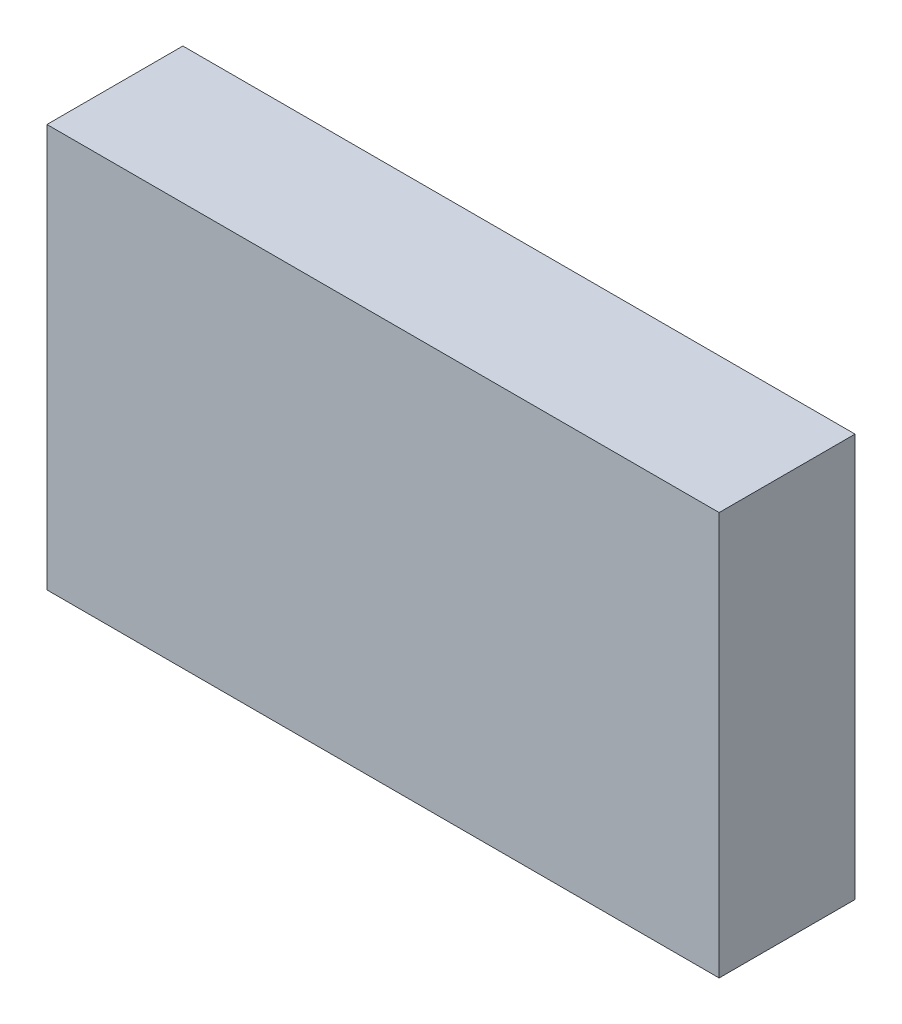
ISO-10303-21;
HEADER;
FILE_DESCRIPTION(('STEP AP214'),'2;1');
FILE_NAME('part.step','',(''),(''),'','','');
FILE_SCHEMA(('AUTOMOTIVE_DESIGN { 1 0 10303 214 1 1 1 1 }'));
ENDSEC;
DATA;
#1=APPLICATION_CONTEXT('core data for automotive mechanical design processes');
#2=APPLICATION_PROTOCOL_DEFINITION('international standard','automotive_design',2000,#1);
#3=PRODUCT_CONTEXT('',#1,'mechanical');
#4=PRODUCT('Part','Part','',(#3));
#5=PRODUCT_RELATED_PRODUCT_CATEGORY('part','',(#4));
#6=PRODUCT_DEFINITION_FORMATION('','',#4);
#7=PRODUCT_DEFINITION_CONTEXT('part definition',#1,'design');
#8=PRODUCT_DEFINITION('design','',#6,#7);
#9=PRODUCT_DEFINITION_SHAPE('','',#8);
#10=(LENGTH_UNIT() NAMED_UNIT(*) SI_UNIT(.MILLI.,.METRE.));
#11=(NAMED_UNIT(*) PLANE_ANGLE_UNIT() SI_UNIT($,.RADIAN.));
#12=(NAMED_UNIT(*) SI_UNIT($,.STERADIAN.) SOLID_ANGLE_UNIT());
#13=UNCERTAINTY_MEASURE_WITH_UNIT(LENGTH_MEASURE(1.E-05),#10,'distance_accuracy_value','');
#14=(GEOMETRIC_REPRESENTATION_CONTEXT(3) GLOBAL_UNCERTAINTY_ASSIGNED_CONTEXT((#13)) GLOBAL_UNIT_ASSIGNED_CONTEXT((#10,
#11,#12)) REPRESENTATION_CONTEXT('',''));
#15=CARTESIAN_POINT('',(0.,0.,0.));
#16=DIRECTION('',(0.,0.,1.));
#17=DIRECTION('',(1.,0.,0.));
#18=AXIS2_PLACEMENT_3D('',#15,#16,#17);
#19=CARTESIAN_POINT('',(-2.473,-1.483,1.));
#20=DIRECTION('',(1.,0.,0.));
#21=DIRECTION('',(0.,0.,-1.));
#22=AXIS2_PLACEMENT_3D('',#19,#20,#21);
#23=PLANE('',#22);
#24=DIRECTION('',(0.,-1.,0.));
#25=VECTOR('',#24,1.);
#26=CARTESIAN_POINT('',(-2.473,-1.483,0.));
#27=LINE('',#26,#25);
#28=CARTESIAN_POINT('',(-2.473,1.483,0.));
#29=VERTEX_POINT('',#28);
#30=CARTESIAN_POINT('',(-2.473,-1.483,0.));
#31=VERTEX_POINT('',#30);
#32=EDGE_CURVE('E96',#29,#31,#27,.T.);
#33=ORIENTED_EDGE('',*,*,#32,.T.);
#34=DIRECTION('',(0.,0.,-1.));
#35=VECTOR('',#34,1.);
#36=CARTESIAN_POINT('',(-2.473,-1.483,1.));
#37=LINE('',#36,#35);
#38=CARTESIAN_POINT('',(-2.473,-1.483,1.));
#39=VERTEX_POINT('',#38);
#40=EDGE_CURVE('E11',#39,#31,#37,.T.);
#41=ORIENTED_EDGE('',*,*,#40,.F.);
#42=DIRECTION('',(0.,-1.,0.));
#43=VECTOR('',#42,1.);
#44=CARTESIAN_POINT('',(-2.473,-1.483,1.));
#45=LINE('',#44,#43);
#46=CARTESIAN_POINT('',(-2.473,1.483,1.));
#47=VERTEX_POINT('',#46);
#48=EDGE_CURVE('E84',#47,#39,#45,.T.);
#49=ORIENTED_EDGE('',*,*,#48,.F.);
#50=DIRECTION('',(0.,0.,-1.));
#51=VECTOR('',#50,1.);
#52=CARTESIAN_POINT('',(-2.473,1.483,1.));
#53=LINE('',#52,#51);
#54=EDGE_CURVE('E92',#47,#29,#53,.T.);
#55=ORIENTED_EDGE('',*,*,#54,.T.);
#56=EDGE_LOOP('',(#33,#41,#49,#55));
#57=FACE_BOUND('',#56,.T.);
#58=ADVANCED_FACE('F33',(#57),#23,.F.);
#59=CARTESIAN_POINT('',(2.473,-1.483,1.));
#60=DIRECTION('',(0.,1.,0.));
#61=DIRECTION('',(0.,0.,1.));
#62=AXIS2_PLACEMENT_3D('',#59,#60,#61);
#63=PLANE('',#62);
#64=DIRECTION('',(1.,0.,0.));
#65=VECTOR('',#64,1.);
#66=CARTESIAN_POINT('',(2.473,-1.483,0.));
#67=LINE('',#66,#65);
#68=CARTESIAN_POINT('',(2.473,-1.483,0.));
#69=VERTEX_POINT('',#68);
#70=EDGE_CURVE('E88',#31,#69,#67,.T.);
#71=ORIENTED_EDGE('',*,*,#70,.T.);
#72=DIRECTION('',(0.,0.,-1.));
#73=VECTOR('',#72,1.);
#74=CARTESIAN_POINT('',(2.473,-1.483,1.));
#75=LINE('',#74,#73);
#76=CARTESIAN_POINT('',(2.473,-1.483,1.));
#77=VERTEX_POINT('',#76);
#78=EDGE_CURVE('E41',#77,#69,#75,.T.);
#79=ORIENTED_EDGE('',*,*,#78,.F.);
#80=DIRECTION('',(1.,0.,0.));
#81=VECTOR('',#80,1.);
#82=CARTESIAN_POINT('',(2.473,-1.483,1.));
#83=LINE('',#82,#81);
#84=EDGE_CURVE('E79',#39,#77,#83,.T.);
#85=ORIENTED_EDGE('',*,*,#84,.F.);
#86=ORIENTED_EDGE('',*,*,#40,.T.);
#87=EDGE_LOOP('',(#71,#79,#85,#86));
#88=FACE_BOUND('',#87,.T.);
#89=ADVANCED_FACE('F87',(#88),#63,.F.);
#90=CARTESIAN_POINT('',(2.473,1.483,1.));
#91=DIRECTION('',(-1.,0.,0.));
#92=DIRECTION('',(0.,0.,1.));
#93=AXIS2_PLACEMENT_3D('',#90,#91,#92);
#94=PLANE('',#93);
#95=DIRECTION('',(0.,1.,0.));
#96=VECTOR('',#95,1.);
#97=CARTESIAN_POINT('',(2.473,1.483,0.));
#98=LINE('',#97,#96);
#99=CARTESIAN_POINT('',(2.473,1.483,0.));
#100=VERTEX_POINT('',#99);
#101=EDGE_CURVE('E66',#69,#100,#98,.T.);
#102=ORIENTED_EDGE('',*,*,#101,.T.);
#103=DIRECTION('',(0.,0.,-1.));
#104=VECTOR('',#103,1.);
#105=CARTESIAN_POINT('',(2.473,1.483,1.));
#106=LINE('',#105,#104);
#107=CARTESIAN_POINT('',(2.473,1.483,1.));
#108=VERTEX_POINT('',#107);
#109=EDGE_CURVE('E89',#108,#100,#106,.T.);
#110=ORIENTED_EDGE('',*,*,#109,.F.);
#111=DIRECTION('',(0.,1.,0.));
#112=VECTOR('',#111,1.);
#113=CARTESIAN_POINT('',(2.473,1.483,1.));
#114=LINE('',#113,#112);
#115=EDGE_CURVE('E82',#77,#108,#114,.T.);
#116=ORIENTED_EDGE('',*,*,#115,.F.);
#117=ORIENTED_EDGE('',*,*,#78,.T.);
#118=EDGE_LOOP('',(#102,#110,#116,#117));
#119=FACE_BOUND('',#118,.T.);
#120=ADVANCED_FACE('F90',(#119),#94,.F.);
#121=CARTESIAN_POINT('',(-2.473,1.483,1.));
#122=DIRECTION('',(0.,-1.,0.));
#123=DIRECTION('',(0.,0.,-1.));
#124=AXIS2_PLACEMENT_3D('',#121,#122,#123);
#125=PLANE('',#124);
#126=DIRECTION('',(-1.,0.,0.));
#127=VECTOR('',#126,1.);
#128=CARTESIAN_POINT('',(-2.473,1.483,0.));
#129=LINE('',#128,#127);
#130=EDGE_CURVE('E72',#100,#29,#129,.T.);
#131=ORIENTED_EDGE('',*,*,#130,.T.);
#132=ORIENTED_EDGE('',*,*,#54,.F.);
#133=DIRECTION('',(-1.,0.,0.));
#134=VECTOR('',#133,1.);
#135=CARTESIAN_POINT('',(-2.473,1.483,1.));
#136=LINE('',#135,#134);
#137=EDGE_CURVE('E49',#108,#47,#136,.T.);
#138=ORIENTED_EDGE('',*,*,#137,.F.);
#139=ORIENTED_EDGE('',*,*,#109,.T.);
#140=EDGE_LOOP('',(#131,#132,#138,#139));
#141=FACE_BOUND('',#140,.T.);
#142=ADVANCED_FACE('F103',(#141),#125,.F.);
#143=CARTESIAN_POINT('',(0.,0.,1.));
#144=DIRECTION('',(0.,0.,-1.));
#145=DIRECTION('',(-1.,0.,0.));
#146=AXIS2_PLACEMENT_3D('',#143,#144,#145);
#147=PLANE('',#146);
#148=ORIENTED_EDGE('',*,*,#48,.T.);
#149=ORIENTED_EDGE('',*,*,#84,.T.);
#150=ORIENTED_EDGE('',*,*,#115,.T.);
#151=ORIENTED_EDGE('',*,*,#137,.T.);
#152=EDGE_LOOP('',(#148,#149,#150,#151));
#153=FACE_BOUND('',#152,.T.);
#154=ADVANCED_FACE('F80',(#153),#147,.F.);
#155=CARTESIAN_POINT('',(0.,0.,0.));
#156=DIRECTION('',(0.,0.,-1.));
#157=DIRECTION('',(-1.,0.,0.));
#158=AXIS2_PLACEMENT_3D('',#155,#156,#157);
#159=PLANE('',#158);
#160=ORIENTED_EDGE('',*,*,#32,.F.);
#161=ORIENTED_EDGE('',*,*,#130,.F.);
#162=ORIENTED_EDGE('',*,*,#101,.F.);
#163=ORIENTED_EDGE('',*,*,#70,.F.);
#164=EDGE_LOOP('',(#160,#161,#162,#163));
#165=FACE_BOUND('',#164,.T.);
#166=ADVANCED_FACE('F106',(#165),#159,.T.);
#167=CLOSED_SHELL('',(#58,#89,#120,#142,#154,#166));
#168=MANIFOLD_SOLID_BREP('B2',#167);
#169=ADVANCED_BREP_SHAPE_REPRESENTATION('',(#18,#168),#14);
#170=SHAPE_DEFINITION_REPRESENTATION(#9,#169);
ENDSEC;
END-ISO-10303-21;
